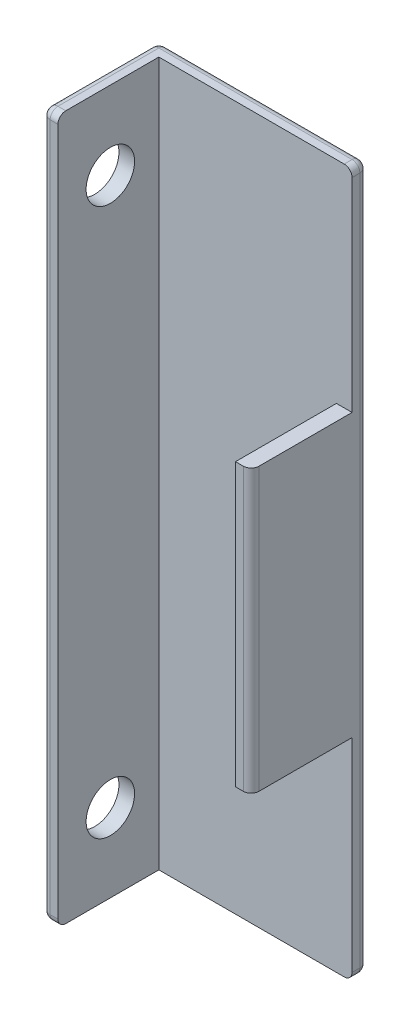
ISO-10303-21;
HEADER;
FILE_DESCRIPTION(('STEP AP214'),'2;1');
FILE_NAME('part.step','',(''),(''),'','','');
FILE_SCHEMA(('AUTOMOTIVE_DESIGN { 1 0 10303 214 1 1 1 1 }'));
ENDSEC;
DATA;
#1=APPLICATION_CONTEXT('core data for automotive mechanical design processes');
#2=APPLICATION_PROTOCOL_DEFINITION('international standard','automotive_design',2000,#1);
#3=PRODUCT_CONTEXT('',#1,'mechanical');
#4=PRODUCT('Part','Part','',(#3));
#5=PRODUCT_RELATED_PRODUCT_CATEGORY('part','',(#4));
#6=PRODUCT_DEFINITION_FORMATION('','',#4);
#7=PRODUCT_DEFINITION_CONTEXT('part definition',#1,'design');
#8=PRODUCT_DEFINITION('design','',#6,#7);
#9=PRODUCT_DEFINITION_SHAPE('','',#8);
#10=(LENGTH_UNIT() NAMED_UNIT(*) SI_UNIT(.MILLI.,.METRE.));
#11=(NAMED_UNIT(*) PLANE_ANGLE_UNIT() SI_UNIT($,.RADIAN.));
#12=(NAMED_UNIT(*) SI_UNIT($,.STERADIAN.) SOLID_ANGLE_UNIT());
#13=UNCERTAINTY_MEASURE_WITH_UNIT(LENGTH_MEASURE(1.E-05),#10,'distance_accuracy_value','');
#14=(GEOMETRIC_REPRESENTATION_CONTEXT(3) GLOBAL_UNCERTAINTY_ASSIGNED_CONTEXT((#13)) GLOBAL_UNIT_ASSIGNED_CONTEXT((#10,
#11,#12)) REPRESENTATION_CONTEXT('',''));
#15=CARTESIAN_POINT('',(0.,0.,0.));
#16=DIRECTION('',(0.,0.,1.));
#17=DIRECTION('',(1.,0.,0.));
#18=AXIS2_PLACEMENT_3D('',#15,#16,#17);
#19=CARTESIAN_POINT('',(25.7,0.,13.9));
#20=DIRECTION('',(0.,-1.,0.));
#21=DIRECTION('',(0.,0.,-1.));
#22=AXIS2_PLACEMENT_3D('',#19,#20,#21);
#23=CYLINDRICAL_SURFACE('',#22,1.);
#24=CARTESIAN_POINT('',(25.7,63.,13.9));
#25=DIRECTION('',(0.,-1.,0.));
#26=DIRECTION('',(1.,0.,0.));
#27=AXIS2_PLACEMENT_3D('',#24,#25,#26);
#28=CIRCLE('',#27,1.);
#29=CARTESIAN_POINT('',(25.7,63.,14.9));
#30=VERTEX_POINT('',#29);
#31=CARTESIAN_POINT('',(26.7,63.,13.9));
#32=VERTEX_POINT('',#31);
#33=EDGE_CURVE('E328',#30,#32,#28,.F.);
#34=ORIENTED_EDGE('',*,*,#33,.F.);
#35=DIRECTION('',(0.,-1.,0.));
#36=VECTOR('',#35,1.);
#37=CARTESIAN_POINT('',(25.7,0.,14.9));
#38=LINE('',#37,#36);
#39=CARTESIAN_POINT('',(25.7,27.,14.9));
#40=VERTEX_POINT('',#39);
#41=EDGE_CURVE('E317',#40,#30,#38,.F.);
#42=ORIENTED_EDGE('',*,*,#41,.F.);
#43=CARTESIAN_POINT('',(25.7,27.,13.9));
#44=DIRECTION('',(0.,-1.,0.));
#45=DIRECTION('',(1.,0.,0.));
#46=AXIS2_PLACEMENT_3D('',#43,#44,#45);
#47=CIRCLE('',#46,1.);
#48=CARTESIAN_POINT('',(26.7,27.,13.9));
#49=VERTEX_POINT('',#48);
#50=EDGE_CURVE('E55',#40,#49,#47,.F.);
#51=ORIENTED_EDGE('',*,*,#50,.T.);
#52=DIRECTION('',(0.,-1.,0.));
#53=VECTOR('',#52,1.);
#54=CARTESIAN_POINT('',(26.7,0.,13.9));
#55=LINE('',#54,#53);
#56=EDGE_CURVE('E320',#32,#49,#55,.T.);
#57=ORIENTED_EDGE('',*,*,#56,.F.);
#58=EDGE_LOOP('',(#34,#42,#51,#57));
#59=FACE_BOUND('',#58,.T.);
#60=ADVANCED_FACE('F34',(#59),#23,.T.);
#61=CARTESIAN_POINT('',(25.7,1.,2.));
#62=DIRECTION('',(0.,0.,1.));
#63=DIRECTION('',(1.,0.,0.));
#64=AXIS2_PLACEMENT_3D('',#61,#62,#63);
#65=CYLINDRICAL_SURFACE('',#64,1.);
#66=DIRECTION('',(0.,0.,1.));
#67=VECTOR('',#66,1.);
#68=CARTESIAN_POINT('',(26.7,1.,2.));
#69=LINE('',#68,#67);
#70=CARTESIAN_POINT('',(26.7,1.,2.));
#71=VERTEX_POINT('',#70);
#72=CARTESIAN_POINT('',(26.7,1.,1.));
#73=VERTEX_POINT('',#72);
#74=EDGE_CURVE('E269',#71,#73,#69,.F.);
#75=ORIENTED_EDGE('',*,*,#74,.F.);
#76=CARTESIAN_POINT('',(25.7,1.,2.));
#77=DIRECTION('',(0.,0.,1.));
#78=DIRECTION('',(1.,0.,0.));
#79=AXIS2_PLACEMENT_3D('',#76,#77,#78);
#80=CIRCLE('',#79,1.);
#81=CARTESIAN_POINT('',(25.7,0.,2.));
#82=VERTEX_POINT('',#81);
#83=EDGE_CURVE('E331',#71,#82,#80,.F.);
#84=ORIENTED_EDGE('',*,*,#83,.T.);
#85=DIRECTION('',(0.,0.,1.));
#86=VECTOR('',#85,1.);
#87=CARTESIAN_POINT('',(25.7,0.,2.));
#88=LINE('',#87,#86);
#89=CARTESIAN_POINT('',(25.7,0.,1.));
#90=VERTEX_POINT('',#89);
#91=EDGE_CURVE('E249',#90,#82,#88,.T.);
#92=ORIENTED_EDGE('',*,*,#91,.F.);
#93=CARTESIAN_POINT('',(25.7,1.,1.));
#94=DIRECTION('',(0.,0.,1.));
#95=DIRECTION('',(1.,0.,0.));
#96=AXIS2_PLACEMENT_3D('',#93,#94,#95);
#97=CIRCLE('',#96,1.);
#98=EDGE_CURVE('E277',#90,#73,#97,.T.);
#99=ORIENTED_EDGE('',*,*,#98,.T.);
#100=EDGE_LOOP('',(#75,#84,#92,#99));
#101=FACE_BOUND('',#100,.T.);
#102=ADVANCED_FACE('F439',(#101),#65,.T.);
#103=CARTESIAN_POINT('',(0.,0.,2.));
#104=DIRECTION('',(0.,1.,0.));
#105=DIRECTION('',(0.,0.,1.));
#106=AXIS2_PLACEMENT_3D('',#103,#104,#105);
#107=PLANE('',#106);
#108=ORIENTED_EDGE('',*,*,#91,.T.);
#109=DIRECTION('',(1.,0.,0.));
#110=VECTOR('',#109,1.);
#111=CARTESIAN_POINT('',(0.,0.,2.));
#112=LINE('',#111,#110);
#113=CARTESIAN_POINT('',(2.,0.,2.));
#114=VERTEX_POINT('',#113);
#115=EDGE_CURVE('E201',#114,#82,#112,.T.);
#116=ORIENTED_EDGE('',*,*,#115,.F.);
#117=DIRECTION('',(0.,0.,-1.));
#118=VECTOR('',#117,1.);
#119=CARTESIAN_POINT('',(2.00000000000001,0.,14.9));
#120=LINE('',#119,#118);
#121=CARTESIAN_POINT('',(2.00000000000001,0.,13.9));
#122=VERTEX_POINT('',#121);
#123=EDGE_CURVE('E199',#122,#114,#120,.T.);
#124=ORIENTED_EDGE('',*,*,#123,.F.);
#125=DIRECTION('',(-1.,0.,0.));
#126=VECTOR('',#125,1.);
#127=CARTESIAN_POINT('',(0.,0.,13.9));
#128=LINE('',#127,#126);
#129=CARTESIAN_POINT('',(1.,0.,13.9));
#130=VERTEX_POINT('',#129);
#131=EDGE_CURVE('E280',#122,#130,#128,.T.);
#132=ORIENTED_EDGE('',*,*,#131,.T.);
#133=DIRECTION('',(0.,0.,-1.));
#134=VECTOR('',#133,1.);
#135=CARTESIAN_POINT('',(1.,0.,2.));
#136=LINE('',#135,#134);
#137=CARTESIAN_POINT('',(1.,0.,1.));
#138=VERTEX_POINT('',#137);
#139=EDGE_CURVE('E255',#130,#138,#136,.T.);
#140=ORIENTED_EDGE('',*,*,#139,.T.);
#141=DIRECTION('',(1.,0.,0.));
#142=VECTOR('',#141,1.);
#143=CARTESIAN_POINT('',(0.,0.,1.));
#144=LINE('',#143,#142);
#145=EDGE_CURVE('E252',#138,#90,#144,.T.);
#146=ORIENTED_EDGE('',*,*,#145,.T.);
#147=EDGE_LOOP('',(#108,#116,#124,#132,#140,#146));
#148=FACE_BOUND('',#147,.T.);
#149=ADVANCED_FACE('F375',(#148),#107,.F.);
#150=CARTESIAN_POINT('',(26.7,0.,2.));
#151=DIRECTION('',(-1.,0.,0.));
#152=DIRECTION('',(0.,0.,1.));
#153=AXIS2_PLACEMENT_3D('',#150,#151,#152);
#154=PLANE('',#153);
#155=DIRECTION('',(0.,0.,-1.));
#156=VECTOR('',#155,1.);
#157=CARTESIAN_POINT('',(26.7,89.,2.));
#158=LINE('',#157,#156);
#159=CARTESIAN_POINT('',(26.7,89.,1.));
#160=VERTEX_POINT('',#159);
#161=CARTESIAN_POINT('',(26.7,89.,2.));
#162=VERTEX_POINT('',#161);
#163=EDGE_CURVE('E234',#160,#162,#158,.F.);
#164=ORIENTED_EDGE('',*,*,#163,.T.);
#165=DIRECTION('',(0.,1.,0.));
#166=VECTOR('',#165,1.);
#167=CARTESIAN_POINT('',(26.7,90.,2.));
#168=LINE('',#167,#166);
#169=CARTESIAN_POINT('',(26.7,63.,2.));
#170=VERTEX_POINT('',#169);
#171=EDGE_CURVE('E168',#170,#162,#168,.T.);
#172=ORIENTED_EDGE('',*,*,#171,.F.);
#173=DIRECTION('',(0.,0.,-1.));
#174=VECTOR('',#173,1.);
#175=CARTESIAN_POINT('',(26.7,63.,2.));
#176=LINE('',#175,#174);
#177=EDGE_CURVE('E164',#32,#170,#176,.T.);
#178=ORIENTED_EDGE('',*,*,#177,.F.);
#179=ORIENTED_EDGE('',*,*,#56,.T.);
#180=DIRECTION('',(0.,0.,-1.));
#181=VECTOR('',#180,1.);
#182=CARTESIAN_POINT('',(26.7,27.,2.));
#183=LINE('',#182,#181);
#184=CARTESIAN_POINT('',(26.7,27.,2.));
#185=VERTEX_POINT('',#184);
#186=EDGE_CURVE('E736',#49,#185,#183,.T.);
#187=ORIENTED_EDGE('',*,*,#186,.T.);
#188=DIRECTION('',(0.,-1.,0.));
#189=VECTOR('',#188,1.);
#190=CARTESIAN_POINT('',(26.7,0.,2.));
#191=LINE('',#190,#189);
#192=EDGE_CURVE('E436',#185,#71,#191,.T.);
#193=ORIENTED_EDGE('',*,*,#192,.T.);
#194=ORIENTED_EDGE('',*,*,#74,.T.);
#195=DIRECTION('',(0.,-1.,0.));
#196=VECTOR('',#195,1.);
#197=CARTESIAN_POINT('',(26.7,0.,1.));
#198=LINE('',#197,#196);
#199=EDGE_CURVE('E232',#73,#160,#198,.F.);
#200=ORIENTED_EDGE('',*,*,#199,.T.);
#201=EDGE_LOOP('',(#164,#172,#178,#179,#187,#193,#194,#200));
#202=FACE_BOUND('',#201,.T.);
#203=ADVANCED_FACE('F432',(#202),#154,.F.);
#204=CARTESIAN_POINT('',(24.7,90.,14.9));
#205=DIRECTION('',(1.,0.,0.));
#206=DIRECTION('',(0.,1.,0.));
#207=AXIS2_PLACEMENT_3D('',#204,#205,#206);
#208=PLANE('',#207);
#209=DIRECTION('',(0.,-1.,0.));
#210=VECTOR('',#209,1.);
#211=CARTESIAN_POINT('',(24.7,90.,14.9));
#212=LINE('',#211,#210);
#213=CARTESIAN_POINT('',(24.7,63.,14.9));
#214=VERTEX_POINT('',#213);
#215=CARTESIAN_POINT('',(24.7,27.,14.9));
#216=VERTEX_POINT('',#215);
#217=EDGE_CURVE('E177',#214,#216,#212,.T.);
#218=ORIENTED_EDGE('',*,*,#217,.F.);
#219=DIRECTION('',(0.,0.,1.));
#220=VECTOR('',#219,1.);
#221=CARTESIAN_POINT('',(24.7,63.,2.));
#222=LINE('',#221,#220);
#223=CARTESIAN_POINT('',(24.7,63.,2.));
#224=VERTEX_POINT('',#223);
#225=EDGE_CURVE('E48',#224,#214,#222,.T.);
#226=ORIENTED_EDGE('',*,*,#225,.F.);
#227=DIRECTION('',(0.,-1.,0.));
#228=VECTOR('',#227,1.);
#229=CARTESIAN_POINT('',(24.7,90.,2.));
#230=LINE('',#229,#228);
#231=CARTESIAN_POINT('',(24.7,27.,2.));
#232=VERTEX_POINT('',#231);
#233=EDGE_CURVE('E175',#224,#232,#230,.T.);
#234=ORIENTED_EDGE('',*,*,#233,.T.);
#235=DIRECTION('',(0.,0.,1.));
#236=VECTOR('',#235,1.);
#237=CARTESIAN_POINT('',(24.7,27.,2.));
#238=LINE('',#237,#236);
#239=EDGE_CURVE('E178',#232,#216,#238,.T.);
#240=ORIENTED_EDGE('',*,*,#239,.T.);
#241=EDGE_LOOP('',(#218,#226,#234,#240));
#242=FACE_BOUND('',#241,.T.);
#243=ADVANCED_FACE('F173',(#242),#208,.F.);
#244=CARTESIAN_POINT('',(0.,0.,14.9));
#245=DIRECTION('',(0.,0.,-1.));
#246=DIRECTION('',(-1.,0.,0.));
#247=AXIS2_PLACEMENT_3D('',#244,#245,#246);
#248=PLANE('',#247);
#249=ORIENTED_EDGE('',*,*,#41,.T.);
#250=DIRECTION('',(-1.,0.,0.));
#251=VECTOR('',#250,1.);
#252=CARTESIAN_POINT('',(0.,63.,14.9));
#253=LINE('',#252,#251);
#254=EDGE_CURVE('E11',#30,#214,#253,.T.);
#255=ORIENTED_EDGE('',*,*,#254,.T.);
#256=ORIENTED_EDGE('',*,*,#217,.T.);
#257=DIRECTION('',(-1.,0.,0.));
#258=VECTOR('',#257,1.);
#259=CARTESIAN_POINT('',(0.,27.,14.9));
#260=LINE('',#259,#258);
#261=EDGE_CURVE('E41',#40,#216,#260,.T.);
#262=ORIENTED_EDGE('',*,*,#261,.F.);
#263=EDGE_LOOP('',(#249,#255,#256,#262));
#264=FACE_BOUND('',#263,.T.);
#265=ADVANCED_FACE('F326',(#264),#248,.F.);
#266=CARTESIAN_POINT('',(1.,89.,13.9));
#267=DIRECTION('',(0.,0.,1.));
#268=DIRECTION('',(1.,0.,0.));
#269=AXIS2_PLACEMENT_3D('',#266,#267,#268);
#270=SPHERICAL_SURFACE('',#269,1.);
#271=CARTESIAN_POINT('',(1.,89.,13.9));
#272=DIRECTION('',(1.,0.,0.));
#273=DIRECTION('',(0.,0.,-1.));
#274=AXIS2_PLACEMENT_3D('',#271,#272,#273);
#275=CIRCLE('',#274,1.);
#276=CARTESIAN_POINT('',(1.,90.,13.9));
#277=VERTEX_POINT('',#276);
#278=CARTESIAN_POINT('',(1.,89.,14.9));
#279=VERTEX_POINT('',#278);
#280=EDGE_CURVE('E315',#277,#279,#275,.T.);
#281=ORIENTED_EDGE('',*,*,#280,.F.);
#282=CARTESIAN_POINT('',(1.,89.,13.9));
#283=DIRECTION('',(0.,0.,1.));
#284=DIRECTION('',(1.,0.,0.));
#285=AXIS2_PLACEMENT_3D('',#282,#283,#284);
#286=CIRCLE('',#285,1.);
#287=CARTESIAN_POINT('',(0.,89.,13.9));
#288=VERTEX_POINT('',#287);
#289=EDGE_CURVE('E302',#288,#277,#286,.F.);
#290=ORIENTED_EDGE('',*,*,#289,.F.);
#291=CARTESIAN_POINT('',(1.,89.,13.9));
#292=DIRECTION('',(0.,1.,0.));
#293=DIRECTION('',(0.,0.,1.));
#294=AXIS2_PLACEMENT_3D('',#291,#292,#293);
#295=CIRCLE('',#294,1.);
#296=EDGE_CURVE('E312',#288,#279,#295,.T.);
#297=ORIENTED_EDGE('',*,*,#296,.T.);
#298=EDGE_LOOP('',(#281,#290,#297));
#299=FACE_BOUND('',#298,.T.);
#300=ADVANCED_FACE('F389',(#299),#270,.T.);
#301=CARTESIAN_POINT('',(1.,0.,13.9));
#302=DIRECTION('',(0.,-1.,0.));
#303=DIRECTION('',(0.,0.,-1.));
#304=AXIS2_PLACEMENT_3D('',#301,#302,#303);
#305=CYLINDRICAL_SURFACE('',#304,1.);
#306=ORIENTED_EDGE('',*,*,#296,.F.);
#307=DIRECTION('',(0.,1.,0.));
#308=VECTOR('',#307,1.);
#309=CARTESIAN_POINT('',(0.,0.,13.9));
#310=LINE('',#309,#308);
#311=CARTESIAN_POINT('',(0.,1.,13.9));
#312=VERTEX_POINT('',#311);
#313=EDGE_CURVE('E299',#312,#288,#310,.T.);
#314=ORIENTED_EDGE('',*,*,#313,.F.);
#315=CARTESIAN_POINT('',(1.,1.,13.9));
#316=DIRECTION('',(0.,1.,0.));
#317=DIRECTION('',(0.,0.,1.));
#318=AXIS2_PLACEMENT_3D('',#315,#316,#317);
#319=CIRCLE('',#318,1.);
#320=CARTESIAN_POINT('',(1.,1.,14.9));
#321=VERTEX_POINT('',#320);
#322=EDGE_CURVE('E310',#312,#321,#319,.T.);
#323=ORIENTED_EDGE('',*,*,#322,.T.);
#324=DIRECTION('',(0.,1.,0.));
#325=VECTOR('',#324,1.);
#326=CARTESIAN_POINT('',(1.,0.,14.9));
#327=LINE('',#326,#325);
#328=EDGE_CURVE('E286',#279,#321,#327,.F.);
#329=ORIENTED_EDGE('',*,*,#328,.F.);
#330=EDGE_LOOP('',(#306,#314,#323,#329));
#331=FACE_BOUND('',#330,.T.);
#332=ADVANCED_FACE('F386',(#331),#305,.T.);
#333=CARTESIAN_POINT('',(1.,1.,13.9));
#334=DIRECTION('',(0.,0.,1.));
#335=DIRECTION('',(1.,0.,0.));
#336=AXIS2_PLACEMENT_3D('',#333,#334,#335);
#337=SPHERICAL_SURFACE('',#336,1.);
#338=ORIENTED_EDGE('',*,*,#322,.F.);
#339=CARTESIAN_POINT('',(1.,1.,13.9));
#340=DIRECTION('',(0.,0.,-1.));
#341=DIRECTION('',(-1.,0.,0.));
#342=AXIS2_PLACEMENT_3D('',#339,#340,#341);
#343=CIRCLE('',#342,1.);
#344=EDGE_CURVE('E296',#130,#312,#343,.T.);
#345=ORIENTED_EDGE('',*,*,#344,.F.);
#346=CARTESIAN_POINT('',(1.,1.,13.9));
#347=DIRECTION('',(-1.,0.,0.));
#348=DIRECTION('',(0.,0.,1.));
#349=AXIS2_PLACEMENT_3D('',#346,#347,#348);
#350=CIRCLE('',#349,1.);
#351=EDGE_CURVE('E307',#130,#321,#350,.T.);
#352=ORIENTED_EDGE('',*,*,#351,.T.);
#353=EDGE_LOOP('',(#338,#345,#352));
#354=FACE_BOUND('',#353,.T.);
#355=ADVANCED_FACE('F370',(#354),#337,.T.);
#356=CARTESIAN_POINT('',(0.,1.,13.9));
#357=DIRECTION('',(1.,0.,0.));
#358=DIRECTION('',(0.,0.,-1.));
#359=AXIS2_PLACEMENT_3D('',#356,#357,#358);
#360=CYLINDRICAL_SURFACE('',#359,1.);
#361=ORIENTED_EDGE('',*,*,#351,.F.);
#362=ORIENTED_EDGE('',*,*,#131,.F.);
#363=CARTESIAN_POINT('',(2.00000000000001,1.,13.9));
#364=DIRECTION('',(-1.,0.,0.));
#365=DIRECTION('',(0.,-1.,0.));
#366=AXIS2_PLACEMENT_3D('',#363,#364,#365);
#367=CIRCLE('',#366,1.);
#368=CARTESIAN_POINT('',(2.00000000000001,1.00000000000003,14.9));
#369=VERTEX_POINT('',#368);
#370=EDGE_CURVE('E294',#369,#122,#367,.F.);
#371=ORIENTED_EDGE('',*,*,#370,.F.);
#372=DIRECTION('',(-1.,0.,0.));
#373=VECTOR('',#372,1.);
#374=CARTESIAN_POINT('',(0.,1.,14.9));
#375=LINE('',#374,#373);
#376=EDGE_CURVE('E289',#321,#369,#375,.F.);
#377=ORIENTED_EDGE('',*,*,#376,.F.);
#378=EDGE_LOOP('',(#361,#362,#371,#377));
#379=FACE_BOUND('',#378,.T.);
#380=ADVANCED_FACE('F379',(#379),#360,.T.);
#381=CARTESIAN_POINT('',(0.,89.,13.9));
#382=DIRECTION('',(-1.,0.,0.));
#383=DIRECTION('',(0.,0.,1.));
#384=AXIS2_PLACEMENT_3D('',#381,#382,#383);
#385=CYLINDRICAL_SURFACE('',#384,1.);
#386=DIRECTION('',(1.,0.,0.));
#387=VECTOR('',#386,1.);
#388=CARTESIAN_POINT('',(0.,90.,13.9));
#389=LINE('',#388,#387);
#390=CARTESIAN_POINT('',(2.,90.,13.9));
#391=VERTEX_POINT('',#390);
#392=EDGE_CURVE('E305',#277,#391,#389,.T.);
#393=ORIENTED_EDGE('',*,*,#392,.F.);
#394=ORIENTED_EDGE('',*,*,#280,.T.);
#395=DIRECTION('',(1.,0.,0.));
#396=VECTOR('',#395,1.);
#397=CARTESIAN_POINT('',(0.,89.,14.9));
#398=LINE('',#397,#396);
#399=CARTESIAN_POINT('',(2.,89.,14.9));
#400=VERTEX_POINT('',#399);
#401=EDGE_CURVE('E283',#400,#279,#398,.F.);
#402=ORIENTED_EDGE('',*,*,#401,.F.);
#403=CARTESIAN_POINT('',(2.,89.,13.9));
#404=DIRECTION('',(-1.,0.,0.));
#405=DIRECTION('',(0.,-1.,0.));
#406=AXIS2_PLACEMENT_3D('',#403,#404,#405);
#407=CIRCLE('',#406,1.);
#408=EDGE_CURVE('E292',#391,#400,#407,.F.);
#409=ORIENTED_EDGE('',*,*,#408,.F.);
#410=EDGE_LOOP('',(#393,#394,#402,#409));
#411=FACE_BOUND('',#410,.T.);
#412=ADVANCED_FACE('F447',(#411),#385,.T.);
#413=CARTESIAN_POINT('',(25.7,1.,1.));
#414=DIRECTION('',(0.,1.,0.));
#415=DIRECTION('',(0.,0.,1.));
#416=AXIS2_PLACEMENT_3D('',#413,#414,#415);
#417=SPHERICAL_SURFACE('',#416,1.);
#418=ORIENTED_EDGE('',*,*,#98,.F.);
#419=CARTESIAN_POINT('',(25.7,1.,1.));
#420=DIRECTION('',(1.,0.,0.));
#421=DIRECTION('',(0.,0.,-1.));
#422=AXIS2_PLACEMENT_3D('',#419,#420,#421);
#423=CIRCLE('',#422,1.);
#424=CARTESIAN_POINT('',(25.7,1.,0.));
#425=VERTEX_POINT('',#424);
#426=EDGE_CURVE('E275',#90,#425,#423,.T.);
#427=ORIENTED_EDGE('',*,*,#426,.T.);
#428=CARTESIAN_POINT('',(25.7,1.,1.));
#429=DIRECTION('',(0.,1.,0.));
#430=DIRECTION('',(0.,0.,1.));
#431=AXIS2_PLACEMENT_3D('',#428,#429,#430);
#432=CIRCLE('',#431,1.);
#433=EDGE_CURVE('E266',#73,#425,#432,.T.);
#434=ORIENTED_EDGE('',*,*,#433,.F.);
#435=EDGE_LOOP('',(#418,#427,#434));
#436=FACE_BOUND('',#435,.T.);
#437=ADVANCED_FACE('F441',(#436),#417,.T.);
#438=CARTESIAN_POINT('',(0.,1.,1.));
#439=DIRECTION('',(-1.,0.,0.));
#440=DIRECTION('',(0.,0.,1.));
#441=AXIS2_PLACEMENT_3D('',#438,#439,#440);
#442=CYLINDRICAL_SURFACE('',#441,1.);
#443=ORIENTED_EDGE('',*,*,#426,.F.);
#444=ORIENTED_EDGE('',*,*,#145,.F.);
#445=CARTESIAN_POINT('',(1.,1.,1.));
#446=DIRECTION('',(1.,0.,0.));
#447=DIRECTION('',(0.,0.,-1.));
#448=AXIS2_PLACEMENT_3D('',#445,#446,#447);
#449=CIRCLE('',#448,1.);
#450=CARTESIAN_POINT('',(1.,1.,0.));
#451=VERTEX_POINT('',#450);
#452=EDGE_CURVE('E273',#138,#451,#449,.T.);
#453=ORIENTED_EDGE('',*,*,#452,.T.);
#454=DIRECTION('',(1.,0.,0.));
#455=VECTOR('',#454,1.);
#456=CARTESIAN_POINT('',(0.,1.,0.));
#457=LINE('',#456,#455);
#458=EDGE_CURVE('E263',#425,#451,#457,.F.);
#459=ORIENTED_EDGE('',*,*,#458,.F.);
#460=EDGE_LOOP('',(#443,#444,#453,#459));
#461=FACE_BOUND('',#460,.T.);
#462=ADVANCED_FACE('F415',(#461),#442,.T.);
#463=CARTESIAN_POINT('',(1.,1.,1.));
#464=DIRECTION('',(0.,1.,0.));
#465=DIRECTION('',(0.,0.,1.));
#466=AXIS2_PLACEMENT_3D('',#463,#464,#465);
#467=SPHERICAL_SURFACE('',#466,1.);
#468=ORIENTED_EDGE('',*,*,#452,.F.);
#469=CARTESIAN_POINT('',(1.,1.,1.));
#470=DIRECTION('',(0.,0.,-1.));
#471=DIRECTION('',(-1.,0.,0.));
#472=AXIS2_PLACEMENT_3D('',#469,#470,#471);
#473=CIRCLE('',#472,1.);
#474=CARTESIAN_POINT('',(0.,1.,1.));
#475=VERTEX_POINT('',#474);
#476=EDGE_CURVE('E271',#138,#475,#473,.T.);
#477=ORIENTED_EDGE('',*,*,#476,.T.);
#478=CARTESIAN_POINT('',(1.,1.,1.));
#479=DIRECTION('',(0.,-1.,0.));
#480=DIRECTION('',(0.,0.,-1.));
#481=AXIS2_PLACEMENT_3D('',#478,#479,#480);
#482=CIRCLE('',#481,1.);
#483=EDGE_CURVE('E260',#451,#475,#482,.F.);
#484=ORIENTED_EDGE('',*,*,#483,.F.);
#485=EDGE_LOOP('',(#468,#477,#484));
#486=FACE_BOUND('',#485,.T.);
#487=ADVANCED_FACE('F411',(#486),#467,.T.);
#488=CARTESIAN_POINT('',(1.,1.,2.));
#489=DIRECTION('',(0.,0.,-1.));
#490=DIRECTION('',(-1.,0.,0.));
#491=AXIS2_PLACEMENT_3D('',#488,#489,#490);
#492=CYLINDRICAL_SURFACE('',#491,1.);
#493=ORIENTED_EDGE('',*,*,#139,.F.);
#494=ORIENTED_EDGE('',*,*,#344,.T.);
#495=DIRECTION('',(0.,0.,-1.));
#496=VECTOR('',#495,1.);
#497=CARTESIAN_POINT('',(0.,1.,2.));
#498=LINE('',#497,#496);
#499=EDGE_CURVE('E257',#475,#312,#498,.F.);
#500=ORIENTED_EDGE('',*,*,#499,.F.);
#501=ORIENTED_EDGE('',*,*,#476,.F.);
#502=EDGE_LOOP('',(#493,#494,#500,#501));
#503=FACE_BOUND('',#502,.T.);
#504=ADVANCED_FACE('F366',(#503),#492,.T.);
#505=CARTESIAN_POINT('',(25.7,89.,1.));
#506=DIRECTION('',(-1.,0.,0.));
#507=DIRECTION('',(0.,0.,1.));
#508=AXIS2_PLACEMENT_3D('',#505,#506,#507);
#509=SPHERICAL_SURFACE('',#508,1.);
#510=CARTESIAN_POINT('',(25.7,89.,1.));
#511=DIRECTION('',(0.,-1.,0.));
#512=DIRECTION('',(0.,0.,-1.));
#513=AXIS2_PLACEMENT_3D('',#510,#511,#512);
#514=CIRCLE('',#513,1.);
#515=CARTESIAN_POINT('',(25.7,89.,0.));
#516=VERTEX_POINT('',#515);
#517=EDGE_CURVE('E246',#516,#160,#514,.T.);
#518=ORIENTED_EDGE('',*,*,#517,.F.);
#519=CARTESIAN_POINT('',(25.7,89.,1.));
#520=DIRECTION('',(1.,0.,0.));
#521=DIRECTION('',(0.,0.,-1.));
#522=AXIS2_PLACEMENT_3D('',#519,#520,#521);
#523=CIRCLE('',#522,1.);
#524=CARTESIAN_POINT('',(25.7,90.,1.));
#525=VERTEX_POINT('',#524);
#526=EDGE_CURVE('E237',#525,#516,#523,.F.);
#527=ORIENTED_EDGE('',*,*,#526,.F.);
#528=CARTESIAN_POINT('',(25.7,89.,1.));
#529=DIRECTION('',(0.,0.,-1.));
#530=DIRECTION('',(-1.,0.,0.));
#531=AXIS2_PLACEMENT_3D('',#528,#529,#530);
#532=CIRCLE('',#531,1.);
#533=EDGE_CURVE('E243',#525,#160,#532,.T.);
#534=ORIENTED_EDGE('',*,*,#533,.T.);
#535=EDGE_LOOP('',(#518,#527,#534));
#536=FACE_BOUND('',#535,.T.);
#537=ADVANCED_FACE('F426',(#536),#509,.T.);
#538=CARTESIAN_POINT('',(25.7,89.,2.));
#539=DIRECTION('',(0.,0.,-1.));
#540=DIRECTION('',(-1.,0.,0.));
#541=AXIS2_PLACEMENT_3D('',#538,#539,#540);
#542=CYLINDRICAL_SURFACE('',#541,1.);
#543=CARTESIAN_POINT('',(25.7,89.,2.));
#544=DIRECTION('',(0.,0.,-1.));
#545=DIRECTION('',(0.,1.,0.));
#546=AXIS2_PLACEMENT_3D('',#543,#544,#545);
#547=CIRCLE('',#546,1.);
#548=CARTESIAN_POINT('',(25.7,90.,2.));
#549=VERTEX_POINT('',#548);
#550=EDGE_CURVE('E334',#162,#549,#547,.F.);
#551=ORIENTED_EDGE('',*,*,#550,.F.);
#552=ORIENTED_EDGE('',*,*,#163,.F.);
#553=ORIENTED_EDGE('',*,*,#533,.F.);
#554=DIRECTION('',(0.,0.,-1.));
#555=VECTOR('',#554,1.);
#556=CARTESIAN_POINT('',(25.7,90.,2.));
#557=LINE('',#556,#555);
#558=EDGE_CURVE('E230',#549,#525,#557,.T.);
#559=ORIENTED_EDGE('',*,*,#558,.F.);
#560=EDGE_LOOP('',(#551,#552,#553,#559));
#561=FACE_BOUND('',#560,.T.);
#562=ADVANCED_FACE('F430',(#561),#542,.T.);
#563=CARTESIAN_POINT('',(25.7,0.,1.));
#564=DIRECTION('',(0.,1.,0.));
#565=DIRECTION('',(0.,0.,1.));
#566=AXIS2_PLACEMENT_3D('',#563,#564,#565);
#567=CYLINDRICAL_SURFACE('',#566,1.);
#568=ORIENTED_EDGE('',*,*,#199,.F.);
#569=ORIENTED_EDGE('',*,*,#433,.T.);
#570=DIRECTION('',(0.,-1.,0.));
#571=VECTOR('',#570,1.);
#572=CARTESIAN_POINT('',(25.7,0.,0.));
#573=LINE('',#572,#571);
#574=EDGE_CURVE('E240',#516,#425,#573,.T.);
#575=ORIENTED_EDGE('',*,*,#574,.F.);
#576=ORIENTED_EDGE('',*,*,#517,.T.);
#577=EDGE_LOOP('',(#568,#569,#575,#576));
#578=FACE_BOUND('',#577,.T.);
#579=ADVANCED_FACE('F421',(#578),#567,.T.);
#580=CARTESIAN_POINT('',(1.,89.,1.));
#581=DIRECTION('',(1.,0.,0.));
#582=DIRECTION('',(0.,0.,-1.));
#583=AXIS2_PLACEMENT_3D('',#580,#581,#582);
#584=SPHERICAL_SURFACE('',#583,1.);
#585=CARTESIAN_POINT('',(1.,89.,1.));
#586=DIRECTION('',(0.,0.,1.));
#587=DIRECTION('',(1.,0.,0.));
#588=AXIS2_PLACEMENT_3D('',#585,#586,#587);
#589=CIRCLE('',#588,1.);
#590=CARTESIAN_POINT('',(1.,90.,1.));
#591=VERTEX_POINT('',#590);
#592=CARTESIAN_POINT('',(0.,89.,1.));
#593=VERTEX_POINT('',#592);
#594=EDGE_CURVE('E227',#591,#593,#589,.T.);
#595=ORIENTED_EDGE('',*,*,#594,.F.);
#596=CARTESIAN_POINT('',(1.,89.,1.));
#597=DIRECTION('',(1.,0.,0.));
#598=DIRECTION('',(0.,0.,-1.));
#599=AXIS2_PLACEMENT_3D('',#596,#597,#598);
#600=CIRCLE('',#599,1.);
#601=CARTESIAN_POINT('',(1.,89.,0.));
#602=VERTEX_POINT('',#601);
#603=EDGE_CURVE('E218',#602,#591,#600,.T.);
#604=ORIENTED_EDGE('',*,*,#603,.F.);
#605=CARTESIAN_POINT('',(1.,89.,1.));
#606=DIRECTION('',(0.,1.,0.));
#607=DIRECTION('',(0.,0.,1.));
#608=AXIS2_PLACEMENT_3D('',#605,#606,#607);
#609=CIRCLE('',#608,1.);
#610=EDGE_CURVE('E224',#602,#593,#609,.T.);
#611=ORIENTED_EDGE('',*,*,#610,.T.);
#612=EDGE_LOOP('',(#595,#604,#611));
#613=FACE_BOUND('',#612,.T.);
#614=ADVANCED_FACE('F403',(#613),#584,.T.);
#615=CARTESIAN_POINT('',(1.,0.,1.));
#616=DIRECTION('',(0.,-1.,0.));
#617=DIRECTION('',(0.,0.,-1.));
#618=AXIS2_PLACEMENT_3D('',#615,#616,#617);
#619=CYLINDRICAL_SURFACE('',#618,1.);
#620=DIRECTION('',(0.,1.,0.));
#621=VECTOR('',#620,1.);
#622=CARTESIAN_POINT('',(1.,0.,0.));
#623=LINE('',#622,#621);
#624=EDGE_CURVE('E211',#451,#602,#623,.T.);
#625=ORIENTED_EDGE('',*,*,#624,.F.);
#626=ORIENTED_EDGE('',*,*,#483,.T.);
#627=DIRECTION('',(0.,1.,0.));
#628=VECTOR('',#627,1.);
#629=CARTESIAN_POINT('',(0.,0.,1.));
#630=LINE('',#629,#628);
#631=EDGE_CURVE('E215',#593,#475,#630,.F.);
#632=ORIENTED_EDGE('',*,*,#631,.F.);
#633=ORIENTED_EDGE('',*,*,#610,.F.);
#634=EDGE_LOOP('',(#625,#626,#632,#633));
#635=FACE_BOUND('',#634,.T.);
#636=ADVANCED_FACE('F408',(#635),#619,.T.);
#637=CARTESIAN_POINT('',(1.,89.,2.));
#638=DIRECTION('',(0.,0.,1.));
#639=DIRECTION('',(1.,0.,0.));
#640=AXIS2_PLACEMENT_3D('',#637,#638,#639);
#641=CYLINDRICAL_SURFACE('',#640,1.);
#642=DIRECTION('',(0.,0.,1.));
#643=VECTOR('',#642,1.);
#644=CARTESIAN_POINT('',(0.,89.,2.));
#645=LINE('',#644,#643);
#646=EDGE_CURVE('E213',#288,#593,#645,.F.);
#647=ORIENTED_EDGE('',*,*,#646,.F.);
#648=ORIENTED_EDGE('',*,*,#289,.T.);
#649=DIRECTION('',(0.,0.,1.));
#650=VECTOR('',#649,1.);
#651=CARTESIAN_POINT('',(1.,90.,2.));
#652=LINE('',#651,#650);
#653=EDGE_CURVE('E221',#591,#277,#652,.T.);
#654=ORIENTED_EDGE('',*,*,#653,.F.);
#655=ORIENTED_EDGE('',*,*,#594,.T.);
#656=EDGE_LOOP('',(#647,#648,#654,#655));
#657=FACE_BOUND('',#656,.T.);
#658=ADVANCED_FACE('F393',(#657),#641,.T.);
#659=CARTESIAN_POINT('',(0.,89.,1.));
#660=DIRECTION('',(1.,0.,0.));
#661=DIRECTION('',(0.,0.,-1.));
#662=AXIS2_PLACEMENT_3D('',#659,#660,#661);
#663=CYLINDRICAL_SURFACE('',#662,1.);
#664=DIRECTION('',(-1.,0.,0.));
#665=VECTOR('',#664,1.);
#666=CARTESIAN_POINT('',(0.,90.,1.));
#667=LINE('',#666,#665);
#668=EDGE_CURVE('E206',#525,#591,#667,.T.);
#669=ORIENTED_EDGE('',*,*,#668,.F.);
#670=ORIENTED_EDGE('',*,*,#526,.T.);
#671=DIRECTION('',(-1.,0.,0.));
#672=VECTOR('',#671,1.);
#673=CARTESIAN_POINT('',(0.,89.,0.));
#674=LINE('',#673,#672);
#675=EDGE_CURVE('E208',#602,#516,#674,.F.);
#676=ORIENTED_EDGE('',*,*,#675,.F.);
#677=ORIENTED_EDGE('',*,*,#603,.T.);
#678=EDGE_LOOP('',(#669,#670,#676,#677));
#679=FACE_BOUND('',#678,.T.);
#680=ADVANCED_FACE('F424',(#679),#663,.T.);
#681=CARTESIAN_POINT('',(0.,0.,2.));
#682=DIRECTION('',(0.,0.,-1.));
#683=DIRECTION('',(-1.,0.,0.));
#684=AXIS2_PLACEMENT_3D('',#681,#682,#683);
#685=PLANE('',#684);
#686=ORIENTED_EDGE('',*,*,#233,.F.);
#687=DIRECTION('',(-1.,0.,0.));
#688=VECTOR('',#687,1.);
#689=CARTESIAN_POINT('',(56.6234022129837,63.,2.));
#690=LINE('',#689,#688);
#691=EDGE_CURVE('E161',#170,#224,#690,.T.);
#692=ORIENTED_EDGE('',*,*,#691,.F.);
#693=ORIENTED_EDGE('',*,*,#171,.T.);
#694=ORIENTED_EDGE('',*,*,#550,.T.);
#695=DIRECTION('',(-1.,0.,0.));
#696=VECTOR('',#695,1.);
#697=CARTESIAN_POINT('',(0.,90.,2.));
#698=LINE('',#697,#696);
#699=CARTESIAN_POINT('',(2.,90.,2.));
#700=VERTEX_POINT('',#699);
#701=EDGE_CURVE('E203',#549,#700,#698,.T.);
#702=ORIENTED_EDGE('',*,*,#701,.T.);
#703=DIRECTION('',(0.,1.,0.));
#704=VECTOR('',#703,1.);
#705=CARTESIAN_POINT('',(2.,90.,2.));
#706=LINE('',#705,#704);
#707=EDGE_CURVE('E186',#114,#700,#706,.T.);
#708=ORIENTED_EDGE('',*,*,#707,.F.);
#709=ORIENTED_EDGE('',*,*,#115,.T.);
#710=ORIENTED_EDGE('',*,*,#83,.F.);
#711=ORIENTED_EDGE('',*,*,#192,.F.);
#712=DIRECTION('',(-1.,0.,0.));
#713=VECTOR('',#712,1.);
#714=CARTESIAN_POINT('',(56.6234022129837,27.,2.));
#715=LINE('',#714,#713);
#716=EDGE_CURVE('E182',#185,#232,#715,.T.);
#717=ORIENTED_EDGE('',*,*,#716,.T.);
#718=EDGE_LOOP('',(#686,#692,#693,#694,#702,#708,#709,#710,#711,#717));
#719=FACE_BOUND('',#718,.T.);
#720=ADVANCED_FACE('F180',(#719),#685,.F.);
#721=CARTESIAN_POINT('',(0.,0.,2.));
#722=DIRECTION('',(1.,0.,0.));
#723=DIRECTION('',(0.,0.,-1.));
#724=AXIS2_PLACEMENT_3D('',#721,#722,#723);
#725=PLANE('',#724);
#726=CARTESIAN_POINT('',(0.,80.,8.2));
#727=DIRECTION('',(1.,0.,0.));
#728=DIRECTION('',(0.,0.,1.));
#729=AXIS2_PLACEMENT_3D('',#726,#727,#728);
#730=CIRCLE('',#729,3.1);
#731=CARTESIAN_POINT('',(0.,80.,11.3));
#732=VERTEX_POINT('',#731);
#733=EDGE_CURVE('E341',#732,#732,#730,.T.);
#734=ORIENTED_EDGE('',*,*,#733,.T.);
#735=EDGE_LOOP('',(#734));
#736=FACE_BOUND('',#735,.T.);
#737=CARTESIAN_POINT('',(0.,10.,8.2));
#738=DIRECTION('',(-1.,0.,0.));
#739=DIRECTION('',(0.,0.,1.));
#740=AXIS2_PLACEMENT_3D('',#737,#738,#739);
#741=CIRCLE('',#740,3.1);
#742=CARTESIAN_POINT('',(0.,10.,11.3));
#743=VERTEX_POINT('',#742);
#744=EDGE_CURVE('E189',#743,#743,#741,.T.);
#745=ORIENTED_EDGE('',*,*,#744,.F.);
#746=EDGE_LOOP('',(#745));
#747=FACE_BOUND('',#746,.T.);
#748=ORIENTED_EDGE('',*,*,#499,.T.);
#749=ORIENTED_EDGE('',*,*,#313,.T.);
#750=ORIENTED_EDGE('',*,*,#646,.T.);
#751=ORIENTED_EDGE('',*,*,#631,.T.);
#752=EDGE_LOOP('',(#748,#749,#750,#751));
#753=FACE_BOUND('',#752,.T.);
#754=ADVANCED_FACE('F353',(#736,#747,#753),#725,.F.);
#755=CARTESIAN_POINT('',(0.,90.,2.));
#756=DIRECTION('',(0.,-1.,0.));
#757=DIRECTION('',(0.,0.,-1.));
#758=AXIS2_PLACEMENT_3D('',#755,#756,#757);
#759=PLANE('',#758);
#760=ORIENTED_EDGE('',*,*,#701,.F.);
#761=ORIENTED_EDGE('',*,*,#558,.T.);
#762=ORIENTED_EDGE('',*,*,#668,.T.);
#763=ORIENTED_EDGE('',*,*,#653,.T.);
#764=ORIENTED_EDGE('',*,*,#392,.T.);
#765=DIRECTION('',(0.,0.,-1.));
#766=VECTOR('',#765,1.);
#767=CARTESIAN_POINT('',(2.,90.,14.9));
#768=LINE('',#767,#766);
#769=EDGE_CURVE('E195',#391,#700,#768,.T.);
#770=ORIENTED_EDGE('',*,*,#769,.T.);
#771=EDGE_LOOP('',(#760,#761,#762,#763,#764,#770));
#772=FACE_BOUND('',#771,.T.);
#773=ADVANCED_FACE('F356',(#772),#759,.F.);
#774=CARTESIAN_POINT('',(0.,0.,0.));
#775=DIRECTION('',(0.,0.,-1.));
#776=DIRECTION('',(-1.,0.,0.));
#777=AXIS2_PLACEMENT_3D('',#774,#775,#776);
#778=PLANE('',#777);
#779=ORIENTED_EDGE('',*,*,#574,.T.);
#780=ORIENTED_EDGE('',*,*,#458,.T.);
#781=ORIENTED_EDGE('',*,*,#624,.T.);
#782=ORIENTED_EDGE('',*,*,#675,.T.);
#783=EDGE_LOOP('',(#779,#780,#781,#782));
#784=FACE_BOUND('',#783,.T.);
#785=ADVANCED_FACE('F417',(#784),#778,.T.);
#786=CARTESIAN_POINT('',(2.,90.,14.9));
#787=DIRECTION('',(-1.,0.,0.));
#788=DIRECTION('',(0.,-1.,0.));
#789=AXIS2_PLACEMENT_3D('',#786,#787,#788);
#790=PLANE('',#789);
#791=CARTESIAN_POINT('',(2.,80.,8.2));
#792=DIRECTION('',(-1.,0.,0.));
#793=DIRECTION('',(0.,-1.,0.));
#794=AXIS2_PLACEMENT_3D('',#791,#792,#793);
#795=CIRCLE('',#794,3.1);
#796=CARTESIAN_POINT('',(2.,76.9,8.2));
#797=VERTEX_POINT('',#796);
#798=EDGE_CURVE('E344',#797,#797,#795,.F.);
#799=ORIENTED_EDGE('',*,*,#798,.F.);
#800=EDGE_LOOP('',(#799));
#801=FACE_BOUND('',#800,.T.);
#802=CARTESIAN_POINT('',(2.00000000000001,10.,8.2));
#803=DIRECTION('',(-1.,0.,0.));
#804=DIRECTION('',(0.,-1.,0.));
#805=AXIS2_PLACEMENT_3D('',#802,#803,#804);
#806=CIRCLE('',#805,3.1);
#807=CARTESIAN_POINT('',(2.00000000000001,6.9,8.2));
#808=VERTEX_POINT('',#807);
#809=EDGE_CURVE('E184',#808,#808,#806,.T.);
#810=ORIENTED_EDGE('',*,*,#809,.T.);
#811=EDGE_LOOP('',(#810));
#812=FACE_BOUND('',#811,.T.);
#813=DIRECTION('',(0.,1.,0.));
#814=VECTOR('',#813,1.);
#815=CARTESIAN_POINT('',(2.,90.,14.9));
#816=LINE('',#815,#814);
#817=EDGE_CURVE('E192',#369,#400,#816,.T.);
#818=ORIENTED_EDGE('',*,*,#817,.F.);
#819=ORIENTED_EDGE('',*,*,#370,.T.);
#820=ORIENTED_EDGE('',*,*,#123,.T.);
#821=ORIENTED_EDGE('',*,*,#707,.T.);
#822=ORIENTED_EDGE('',*,*,#769,.F.);
#823=ORIENTED_EDGE('',*,*,#408,.T.);
#824=EDGE_LOOP('',(#818,#819,#820,#821,#822,#823));
#825=FACE_BOUND('',#824,.T.);
#826=ADVANCED_FACE('F445',(#801,#812,#825),#790,.F.);
#827=CARTESIAN_POINT('',(0.,0.,14.9));
#828=DIRECTION('',(0.,0.,1.));
#829=DIRECTION('',(1.,0.,0.));
#830=AXIS2_PLACEMENT_3D('',#827,#828,#829);
#831=PLANE('',#830);
#832=ORIENTED_EDGE('',*,*,#328,.T.);
#833=ORIENTED_EDGE('',*,*,#376,.T.);
#834=ORIENTED_EDGE('',*,*,#817,.T.);
#835=ORIENTED_EDGE('',*,*,#401,.T.);
#836=EDGE_LOOP('',(#832,#833,#834,#835));
#837=FACE_BOUND('',#836,.T.);
#838=ADVANCED_FACE('F383',(#837),#831,.T.);
#839=CARTESIAN_POINT('',(26.7,10.,8.2));
#840=DIRECTION('',(-1.,0.,0.));
#841=DIRECTION('',(0.,0.,1.));
#842=AXIS2_PLACEMENT_3D('',#839,#840,#841);
#843=CYLINDRICAL_SURFACE('',#842,3.1);
#844=ORIENTED_EDGE('',*,*,#744,.T.);
#845=EDGE_LOOP('',(#844));
#846=FACE_BOUND('',#845,.T.);
#847=ORIENTED_EDGE('',*,*,#809,.F.);
#848=EDGE_LOOP('',(#847));
#849=FACE_BOUND('',#848,.T.);
#850=ADVANCED_FACE('F350',(#846,#849),#843,.F.);
#851=CARTESIAN_POINT('',(26.7,80.,8.2));
#852=DIRECTION('',(-1.,0.,0.));
#853=DIRECTION('',(0.,0.,1.));
#854=AXIS2_PLACEMENT_3D('',#851,#852,#853);
#855=CYLINDRICAL_SURFACE('',#854,3.1);
#856=ORIENTED_EDGE('',*,*,#733,.F.);
#857=EDGE_LOOP('',(#856));
#858=FACE_BOUND('',#857,.T.);
#859=ORIENTED_EDGE('',*,*,#798,.T.);
#860=EDGE_LOOP('',(#859));
#861=FACE_BOUND('',#860,.T.);
#862=ADVANCED_FACE('F585',(#858,#861),#855,.F.);
#863=CARTESIAN_POINT('',(56.6234022129837,27.,2.));
#864=DIRECTION('',(0.,-1.,0.));
#865=DIRECTION('',(1.,0.,0.));
#866=AXIS2_PLACEMENT_3D('',#863,#864,#865);
#867=PLANE('',#866);
#868=ORIENTED_EDGE('',*,*,#261,.T.);
#869=ORIENTED_EDGE('',*,*,#239,.F.);
#870=ORIENTED_EDGE('',*,*,#716,.F.);
#871=ORIENTED_EDGE('',*,*,#186,.F.);
#872=ORIENTED_EDGE('',*,*,#50,.F.);
#873=EDGE_LOOP('',(#868,#869,#870,#871,#872));
#874=FACE_BOUND('',#873,.T.);
#875=ADVANCED_FACE('F322',(#874),#867,.T.);
#876=CARTESIAN_POINT('',(56.6234022129837,63.,2.));
#877=DIRECTION('',(0.,-1.,0.));
#878=DIRECTION('',(1.,0.,0.));
#879=AXIS2_PLACEMENT_3D('',#876,#877,#878);
#880=PLANE('',#879);
#881=ORIENTED_EDGE('',*,*,#33,.T.);
#882=ORIENTED_EDGE('',*,*,#177,.T.);
#883=ORIENTED_EDGE('',*,*,#691,.T.);
#884=ORIENTED_EDGE('',*,*,#225,.T.);
#885=ORIENTED_EDGE('',*,*,#254,.F.);
#886=EDGE_LOOP('',(#881,#882,#883,#884,#885));
#887=FACE_BOUND('',#886,.T.);
#888=ADVANCED_FACE('F162',(#887),#880,.F.);
#889=CLOSED_SHELL('',(#60,#102,#149,#203,#243,#265,#300,#332,#355,#380,#412,#437,#462,#487,#504,
#537,#562,#579,#614,#636,#658,#680,#720,#754,#773,#785,#826,#838,#850,#862,#875,#888));
#890=MANIFOLD_SOLID_BREP('B2',#889);
#891=ADVANCED_BREP_SHAPE_REPRESENTATION('',(#18,#890),#14);
#892=SHAPE_DEFINITION_REPRESENTATION(#9,#891);
ENDSEC;
END-ISO-10303-21;
